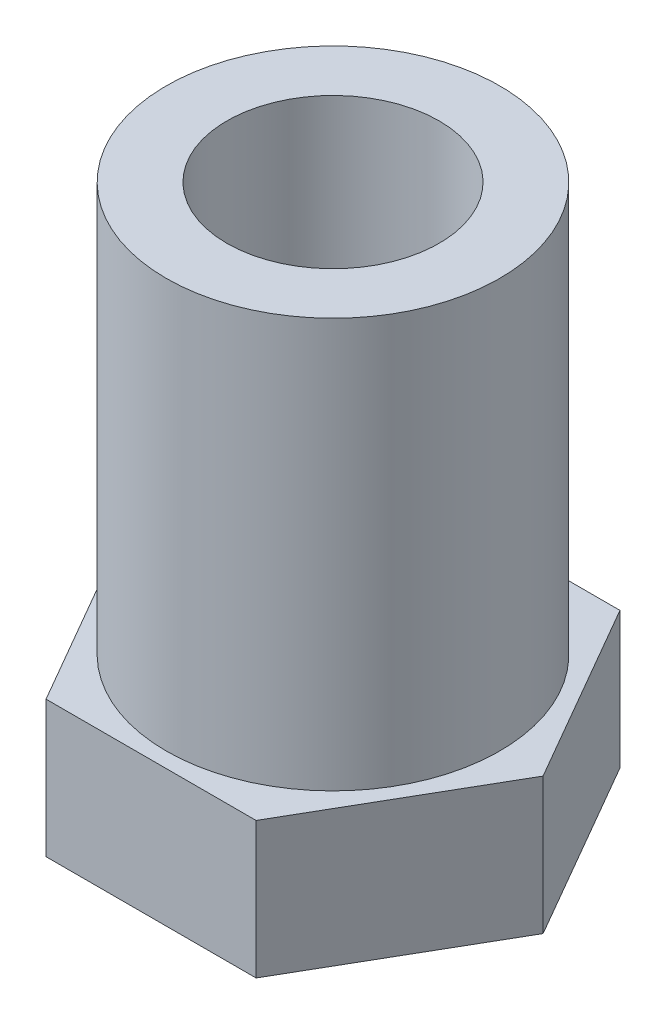
ISO-10303-21;
HEADER;
FILE_DESCRIPTION(('STEP AP214'),'2;1');
FILE_NAME('part.step','',(''),(''),'','','');
FILE_SCHEMA(('AUTOMOTIVE_DESIGN { 1 0 10303 214 1 1 1 1 }'));
ENDSEC;
DATA;
#1=APPLICATION_CONTEXT('core data for automotive mechanical design processes');
#2=APPLICATION_PROTOCOL_DEFINITION('international standard','automotive_design',2000,#1);
#3=PRODUCT_CONTEXT('',#1,'mechanical');
#4=PRODUCT('Part','Part','',(#3));
#5=PRODUCT_RELATED_PRODUCT_CATEGORY('part','',(#4));
#6=PRODUCT_DEFINITION_FORMATION('','',#4);
#7=PRODUCT_DEFINITION_CONTEXT('part definition',#1,'design');
#8=PRODUCT_DEFINITION('design','',#6,#7);
#9=PRODUCT_DEFINITION_SHAPE('','',#8);
#10=(LENGTH_UNIT() NAMED_UNIT(*) SI_UNIT(.MILLI.,.METRE.));
#11=(NAMED_UNIT(*) PLANE_ANGLE_UNIT() SI_UNIT($,.RADIAN.));
#12=(NAMED_UNIT(*) SI_UNIT($,.STERADIAN.) SOLID_ANGLE_UNIT());
#13=UNCERTAINTY_MEASURE_WITH_UNIT(LENGTH_MEASURE(1.E-05),#10,'distance_accuracy_value','');
#14=(GEOMETRIC_REPRESENTATION_CONTEXT(3) GLOBAL_UNCERTAINTY_ASSIGNED_CONTEXT((#13)) GLOBAL_UNIT_ASSIGNED_CONTEXT((#10,
#11,#12)) REPRESENTATION_CONTEXT('',''));
#15=CARTESIAN_POINT('',(0.,0.,0.));
#16=DIRECTION('',(0.,0.,1.));
#17=DIRECTION('',(1.,0.,0.));
#18=AXIS2_PLACEMENT_3D('',#15,#16,#17);
#19=CARTESIAN_POINT('',(3.46410161513783,18.,5.99999999999996));
#20=DIRECTION('',(-0.866025403784442,0.,-0.499999999999995));
#21=DIRECTION('',(-0.499999999999995,0.,0.866025403784442));
#22=AXIS2_PLACEMENT_3D('',#19,#20,#21);
#23=PLANE('',#22);
#24=DIRECTION('',(0.499999999999995,0.,-0.866025403784442));
#25=VECTOR('',#24,1.);
#26=CARTESIAN_POINT('',(5.19615242270667,4.5,2.99999999999998));
#27=LINE('',#26,#25);
#28=CARTESIAN_POINT('',(3.46410161513783,4.5,5.99999999999996));
#29=VERTEX_POINT('',#28);
#30=CARTESIAN_POINT('',(6.92820323027551,4.5,0.));
#31=VERTEX_POINT('',#30);
#32=EDGE_CURVE('E108',#29,#31,#27,.T.);
#33=ORIENTED_EDGE('',*,*,#32,.F.);
#34=DIRECTION('',(0.,-1.,0.));
#35=VECTOR('',#34,1.);
#36=CARTESIAN_POINT('',(3.46410161513783,18.,5.99999999999996));
#37=LINE('',#36,#35);
#38=CARTESIAN_POINT('',(3.46410161513783,0.,5.99999999999996));
#39=VERTEX_POINT('',#38);
#40=EDGE_CURVE('E78',#29,#39,#37,.T.);
#41=ORIENTED_EDGE('',*,*,#40,.T.);
#42=DIRECTION('',(0.499999999999995,0.,-0.866025403784441));
#43=VECTOR('',#42,1.);
#44=CARTESIAN_POINT('',(3.46410161513783,0.,5.99999999999996));
#45=LINE('',#44,#43);
#46=CARTESIAN_POINT('',(6.92820323027551,0.,0.));
#47=VERTEX_POINT('',#46);
#48=EDGE_CURVE('E147',#39,#47,#45,.T.);
#49=ORIENTED_EDGE('',*,*,#48,.T.);
#50=DIRECTION('',(0.,-1.,0.));
#51=VECTOR('',#50,1.);
#52=CARTESIAN_POINT('',(6.92820323027551,18.,0.));
#53=LINE('',#52,#51);
#54=EDGE_CURVE('E12',#31,#47,#53,.T.);
#55=ORIENTED_EDGE('',*,*,#54,.F.);
#56=EDGE_LOOP('',(#33,#41,#49,#55));
#57=FACE_BOUND('',#56,.T.);
#58=ADVANCED_FACE('F55',(#57),#23,.F.);
#59=CARTESIAN_POINT('',(6.92820323027551,18.,0.));
#60=DIRECTION('',(-0.866025403784438,0.,0.500000000000001));
#61=DIRECTION('',(0.500000000000001,0.,0.866025403784438));
#62=AXIS2_PLACEMENT_3D('',#59,#60,#61);
#63=PLANE('',#62);
#64=DIRECTION('',(-0.500000000000001,0.,-0.866025403784438));
#65=VECTOR('',#64,1.);
#66=CARTESIAN_POINT('',(5.19615242270663,4.5,-3.00000000000001));
#67=LINE('',#66,#65);
#68=CARTESIAN_POINT('',(3.46410161513774,4.5,-6.00000000000001));
#69=VERTEX_POINT('',#68);
#70=EDGE_CURVE('E114',#31,#69,#67,.T.);
#71=ORIENTED_EDGE('',*,*,#70,.F.);
#72=ORIENTED_EDGE('',*,*,#54,.T.);
#73=DIRECTION('',(-0.500000000000001,0.,-0.866025403784438));
#74=VECTOR('',#73,1.);
#75=CARTESIAN_POINT('',(6.92820323027551,0.,0.));
#76=LINE('',#75,#74);
#77=CARTESIAN_POINT('',(3.46410161513774,0.,-6.00000000000001));
#78=VERTEX_POINT('',#77);
#79=EDGE_CURVE('E144',#47,#78,#76,.T.);
#80=ORIENTED_EDGE('',*,*,#79,.T.);
#81=DIRECTION('',(0.,-1.,0.));
#82=VECTOR('',#81,1.);
#83=CARTESIAN_POINT('',(3.46410161513774,18.,-6.00000000000001));
#84=LINE('',#83,#82);
#85=EDGE_CURVE('E63',#69,#78,#84,.T.);
#86=ORIENTED_EDGE('',*,*,#85,.F.);
#87=EDGE_LOOP('',(#71,#72,#80,#86));
#88=FACE_BOUND('',#87,.T.);
#89=ADVANCED_FACE('F145',(#88),#63,.F.);
#90=CARTESIAN_POINT('',(3.46410161513774,18.,-6.00000000000001));
#91=DIRECTION('',(0.,0.,1.));
#92=DIRECTION('',(1.,0.,0.));
#93=AXIS2_PLACEMENT_3D('',#90,#91,#92);
#94=PLANE('',#93);
#95=DIRECTION('',(-1.,0.,0.));
#96=VECTOR('',#95,1.);
#97=CARTESIAN_POINT('',(0.,4.5,-6.));
#98=LINE('',#97,#96);
#99=CARTESIAN_POINT('',(-3.46410161513779,4.5,-5.99999999999999));
#100=VERTEX_POINT('',#99);
#101=EDGE_CURVE('E141',#69,#100,#98,.T.);
#102=ORIENTED_EDGE('',*,*,#101,.F.);
#103=ORIENTED_EDGE('',*,*,#85,.T.);
#104=DIRECTION('',(-1.,0.,0.));
#105=VECTOR('',#104,1.);
#106=CARTESIAN_POINT('',(3.46410161513774,0.,-6.00000000000001));
#107=LINE('',#106,#105);
#108=CARTESIAN_POINT('',(-3.46410161513779,0.,-5.99999999999999));
#109=VERTEX_POINT('',#108);
#110=EDGE_CURVE('E139',#78,#109,#107,.T.);
#111=ORIENTED_EDGE('',*,*,#110,.T.);
#112=DIRECTION('',(0.,-1.,0.));
#113=VECTOR('',#112,1.);
#114=CARTESIAN_POINT('',(-3.46410161513779,18.,-5.99999999999999));
#115=LINE('',#114,#113);
#116=EDGE_CURVE('E129',#100,#109,#115,.T.);
#117=ORIENTED_EDGE('',*,*,#116,.F.);
#118=EDGE_LOOP('',(#102,#103,#111,#117));
#119=FACE_BOUND('',#118,.T.);
#120=ADVANCED_FACE('F136',(#119),#94,.F.);
#121=CARTESIAN_POINT('',(-3.46410161513779,18.,-5.99999999999999));
#122=DIRECTION('',(0.866025403784441,0.,0.499999999999995));
#123=DIRECTION('',(0.499999999999995,0.,-0.866025403784441));
#124=AXIS2_PLACEMENT_3D('',#121,#122,#123);
#125=PLANE('',#124);
#126=DIRECTION('',(-0.499999999999995,0.,0.866025403784442));
#127=VECTOR('',#126,1.);
#128=CARTESIAN_POINT('',(-5.19615242270665,4.5,-2.99999999999997));
#129=LINE('',#128,#127);
#130=CARTESIAN_POINT('',(-6.92820323027551,4.5,0.));
#131=VERTEX_POINT('',#130);
#132=EDGE_CURVE('E169',#100,#131,#129,.T.);
#133=ORIENTED_EDGE('',*,*,#132,.F.);
#134=ORIENTED_EDGE('',*,*,#116,.T.);
#135=DIRECTION('',(-0.499999999999995,0.,0.866025403784441));
#136=VECTOR('',#135,1.);
#137=CARTESIAN_POINT('',(-3.46410161513779,0.,-5.99999999999999));
#138=LINE('',#137,#136);
#139=CARTESIAN_POINT('',(-6.92820323027551,0.,0.));
#140=VERTEX_POINT('',#139);
#141=EDGE_CURVE('E153',#109,#140,#138,.T.);
#142=ORIENTED_EDGE('',*,*,#141,.T.);
#143=DIRECTION('',(0.,-1.,0.));
#144=VECTOR('',#143,1.);
#145=CARTESIAN_POINT('',(-6.92820323027551,18.,0.));
#146=LINE('',#145,#144);
#147=EDGE_CURVE('E122',#131,#140,#146,.T.);
#148=ORIENTED_EDGE('',*,*,#147,.F.);
#149=EDGE_LOOP('',(#133,#134,#142,#148));
#150=FACE_BOUND('',#149,.T.);
#151=ADVANCED_FACE('F204',(#150),#125,.F.);
#152=CARTESIAN_POINT('',(-6.92820323027551,18.,0.));
#153=DIRECTION('',(0.866025403784435,0.,-0.500000000000007));
#154=DIRECTION('',(-0.500000000000007,0.,-0.866025403784435));
#155=AXIS2_PLACEMENT_3D('',#152,#153,#154);
#156=PLANE('',#155);
#157=DIRECTION('',(0.500000000000007,0.,0.866025403784435));
#158=VECTOR('',#157,1.);
#159=CARTESIAN_POINT('',(-5.19615242270661,4.5,3.00000000000004));
#160=LINE('',#159,#158);
#161=CARTESIAN_POINT('',(-3.4641016151377,4.5,6.00000000000004));
#162=VERTEX_POINT('',#161);
#163=EDGE_CURVE('E70',#131,#162,#160,.T.);
#164=ORIENTED_EDGE('',*,*,#163,.F.);
#165=ORIENTED_EDGE('',*,*,#147,.T.);
#166=DIRECTION('',(0.500000000000007,0.,0.866025403784434));
#167=VECTOR('',#166,1.);
#168=CARTESIAN_POINT('',(-6.92820323027551,0.,0.));
#169=LINE('',#168,#167);
#170=CARTESIAN_POINT('',(-3.4641016151377,0.,6.00000000000004));
#171=VERTEX_POINT('',#170);
#172=EDGE_CURVE('E124',#140,#171,#169,.T.);
#173=ORIENTED_EDGE('',*,*,#172,.T.);
#174=DIRECTION('',(0.,-1.,0.));
#175=VECTOR('',#174,1.);
#176=CARTESIAN_POINT('',(-3.4641016151377,18.,6.00000000000004));
#177=LINE('',#176,#175);
#178=EDGE_CURVE('E120',#162,#171,#177,.T.);
#179=ORIENTED_EDGE('',*,*,#178,.F.);
#180=EDGE_LOOP('',(#164,#165,#173,#179));
#181=FACE_BOUND('',#180,.T.);
#182=ADVANCED_FACE('F159',(#181),#156,.F.);
#183=CARTESIAN_POINT('',(-3.4641016151377,18.,6.00000000000004));
#184=DIRECTION('',(0.,0.,-1.));
#185=DIRECTION('',(-1.,0.,0.));
#186=AXIS2_PLACEMENT_3D('',#183,#184,#185);
#187=PLANE('',#186);
#188=DIRECTION('',(1.,0.,0.));
#189=VECTOR('',#188,1.);
#190=CARTESIAN_POINT('',(0.,4.5,6.));
#191=LINE('',#190,#189);
#192=EDGE_CURVE('E106',#162,#29,#191,.T.);
#193=ORIENTED_EDGE('',*,*,#192,.F.);
#194=ORIENTED_EDGE('',*,*,#178,.T.);
#195=DIRECTION('',(1.,0.,0.));
#196=VECTOR('',#195,1.);
#197=CARTESIAN_POINT('',(-3.4641016151377,0.,6.00000000000004));
#198=LINE('',#197,#196);
#199=EDGE_CURVE('E118',#171,#39,#198,.T.);
#200=ORIENTED_EDGE('',*,*,#199,.T.);
#201=ORIENTED_EDGE('',*,*,#40,.F.);
#202=EDGE_LOOP('',(#193,#194,#200,#201));
#203=FACE_BOUND('',#202,.T.);
#204=ADVANCED_FACE('F116',(#203),#187,.F.);
#205=CARTESIAN_POINT('',(0.,18.,0.));
#206=DIRECTION('',(0.,-1.,0.));
#207=DIRECTION('',(0.,0.,-1.));
#208=AXIS2_PLACEMENT_3D('',#205,#206,#207);
#209=CYLINDRICAL_SURFACE('',#208,2.);
#210=CARTESIAN_POINT('',(0.,0.,0.));
#211=DIRECTION('',(0.,1.,0.));
#212=DIRECTION('',(0.,0.,1.));
#213=AXIS2_PLACEMENT_3D('',#210,#211,#212);
#214=CIRCLE('',#213,2.);
#215=CARTESIAN_POINT('',(0.,0.,2.));
#216=VERTEX_POINT('',#215);
#217=EDGE_CURVE('E161',#216,#216,#214,.T.);
#218=ORIENTED_EDGE('',*,*,#217,.F.);
#219=EDGE_LOOP('',(#218));
#220=FACE_BOUND('',#219,.T.);
#221=CARTESIAN_POINT('',(0.,4.5,0.));
#222=DIRECTION('',(0.,1.,0.));
#223=DIRECTION('',(0.,0.,1.));
#224=AXIS2_PLACEMENT_3D('',#221,#222,#223);
#225=CIRCLE('',#224,2.);
#226=CARTESIAN_POINT('',(0.,4.5,2.));
#227=VERTEX_POINT('',#226);
#228=EDGE_CURVE('E58',#227,#227,#225,.T.);
#229=ORIENTED_EDGE('',*,*,#228,.T.);
#230=EDGE_LOOP('',(#229));
#231=FACE_BOUND('',#230,.T.);
#232=ADVANCED_FACE('F214',(#220,#231),#209,.F.);
#233=CARTESIAN_POINT('',(0.,0.,0.));
#234=DIRECTION('',(0.,1.,0.));
#235=DIRECTION('',(0.,0.,1.));
#236=AXIS2_PLACEMENT_3D('',#233,#234,#235);
#237=PLANE('',#236);
#238=ORIENTED_EDGE('',*,*,#48,.F.);
#239=ORIENTED_EDGE('',*,*,#199,.F.);
#240=ORIENTED_EDGE('',*,*,#172,.F.);
#241=ORIENTED_EDGE('',*,*,#141,.F.);
#242=ORIENTED_EDGE('',*,*,#110,.F.);
#243=ORIENTED_EDGE('',*,*,#79,.F.);
#244=EDGE_LOOP('',(#238,#239,#240,#241,#242,#243));
#245=FACE_BOUND('',#244,.T.);
#246=ORIENTED_EDGE('',*,*,#217,.T.);
#247=EDGE_LOOP('',(#246));
#248=FACE_BOUND('',#247,.T.);
#249=ADVANCED_FACE('F149',(#245,#248),#237,.F.);
#250=CARTESIAN_POINT('',(0.,4.5,0.));
#251=DIRECTION('',(0.,1.,0.));
#252=DIRECTION('',(0.,0.,1.));
#253=AXIS2_PLACEMENT_3D('',#250,#251,#252);
#254=CYLINDRICAL_SURFACE('',#253,3.5);
#255=CARTESIAN_POINT('',(0.,4.5,0.));
#256=DIRECTION('',(0.,1.,0.));
#257=DIRECTION('',(0.,0.,1.));
#258=AXIS2_PLACEMENT_3D('',#255,#256,#257);
#259=CIRCLE('',#258,3.5);
#260=CARTESIAN_POINT('',(0.,4.5,3.5));
#261=VERTEX_POINT('',#260);
#262=EDGE_CURVE('E168',#261,#261,#259,.T.);
#263=ORIENTED_EDGE('',*,*,#262,.F.);
#264=EDGE_LOOP('',(#263));
#265=FACE_BOUND('',#264,.T.);
#266=CARTESIAN_POINT('',(0.,18.,0.));
#267=DIRECTION('',(0.,1.,0.));
#268=DIRECTION('',(0.,0.,1.));
#269=AXIS2_PLACEMENT_3D('',#266,#267,#268);
#270=CIRCLE('',#269,3.5);
#271=CARTESIAN_POINT('',(0.,18.,3.5));
#272=VERTEX_POINT('',#271);
#273=EDGE_CURVE('E165',#272,#272,#270,.T.);
#274=ORIENTED_EDGE('',*,*,#273,.T.);
#275=EDGE_LOOP('',(#274));
#276=FACE_BOUND('',#275,.T.);
#277=ADVANCED_FACE('F216',(#265,#276),#254,.F.);
#278=CARTESIAN_POINT('',(0.,4.5,0.));
#279=DIRECTION('',(0.,1.,0.));
#280=DIRECTION('',(0.,0.,1.));
#281=AXIS2_PLACEMENT_3D('',#278,#279,#280);
#282=PLANE('',#281);
#283=ORIENTED_EDGE('',*,*,#228,.F.);
#284=EDGE_LOOP('',(#283));
#285=FACE_BOUND('',#284,.T.);
#286=ORIENTED_EDGE('',*,*,#262,.T.);
#287=EDGE_LOOP('',(#286));
#288=FACE_BOUND('',#287,.T.);
#289=ADVANCED_FACE('F195',(#285,#288),#282,.T.);
#290=CARTESIAN_POINT('',(0.,4.5,0.));
#291=DIRECTION('',(0.,1.,0.));
#292=DIRECTION('',(0.,0.,1.));
#293=AXIS2_PLACEMENT_3D('',#290,#291,#292);
#294=CYLINDRICAL_SURFACE('',#293,5.5);
#295=CARTESIAN_POINT('',(0.,4.5,0.));
#296=DIRECTION('',(0.,1.,0.));
#297=DIRECTION('',(0.,0.,1.));
#298=AXIS2_PLACEMENT_3D('',#295,#296,#297);
#299=CIRCLE('',#298,5.5);
#300=CARTESIAN_POINT('',(0.,4.5,5.5));
#301=VERTEX_POINT('',#300);
#302=EDGE_CURVE('E175',#301,#301,#299,.T.);
#303=ORIENTED_EDGE('',*,*,#302,.T.);
#304=EDGE_LOOP('',(#303));
#305=FACE_BOUND('',#304,.T.);
#306=CARTESIAN_POINT('',(0.,18.,0.));
#307=DIRECTION('',(0.,1.,0.));
#308=DIRECTION('',(0.,0.,1.));
#309=AXIS2_PLACEMENT_3D('',#306,#307,#308);
#310=CIRCLE('',#309,5.5);
#311=CARTESIAN_POINT('',(0.,18.,5.5));
#312=VERTEX_POINT('',#311);
#313=EDGE_CURVE('E172',#312,#312,#310,.T.);
#314=ORIENTED_EDGE('',*,*,#313,.F.);
#315=EDGE_LOOP('',(#314));
#316=FACE_BOUND('',#315,.T.);
#317=ADVANCED_FACE('F183',(#305,#316),#294,.T.);
#318=CARTESIAN_POINT('',(0.,4.5,0.));
#319=DIRECTION('',(0.,1.,0.));
#320=DIRECTION('',(0.,0.,1.));
#321=AXIS2_PLACEMENT_3D('',#318,#319,#320);
#322=PLANE('',#321);
#323=ORIENTED_EDGE('',*,*,#302,.F.);
#324=EDGE_LOOP('',(#323));
#325=FACE_BOUND('',#324,.T.);
#326=ORIENTED_EDGE('',*,*,#163,.T.);
#327=ORIENTED_EDGE('',*,*,#192,.T.);
#328=ORIENTED_EDGE('',*,*,#32,.T.);
#329=ORIENTED_EDGE('',*,*,#70,.T.);
#330=ORIENTED_EDGE('',*,*,#101,.T.);
#331=ORIENTED_EDGE('',*,*,#132,.T.);
#332=EDGE_LOOP('',(#326,#327,#328,#329,#330,#331));
#333=FACE_BOUND('',#332,.T.);
#334=ADVANCED_FACE('F107',(#325,#333),#322,.T.);
#335=CARTESIAN_POINT('',(0.,18.,0.));
#336=DIRECTION('',(0.,1.,0.));
#337=DIRECTION('',(0.,0.,1.));
#338=AXIS2_PLACEMENT_3D('',#335,#336,#337);
#339=PLANE('',#338);
#340=ORIENTED_EDGE('',*,*,#273,.F.);
#341=EDGE_LOOP('',(#340));
#342=FACE_BOUND('',#341,.T.);
#343=ORIENTED_EDGE('',*,*,#313,.T.);
#344=EDGE_LOOP('',(#343));
#345=FACE_BOUND('',#344,.T.);
#346=ADVANCED_FACE('F187',(#342,#345),#339,.T.);
#347=CLOSED_SHELL('',(#58,#89,#120,#151,#182,#204,#232,#249,#277,#289,#317,#334,#346));
#348=MANIFOLD_SOLID_BREP('B2',#347);
#349=ADVANCED_BREP_SHAPE_REPRESENTATION('',(#18,#348),#14);
#350=SHAPE_DEFINITION_REPRESENTATION(#9,#349);
ENDSEC;
END-ISO-10303-21;
